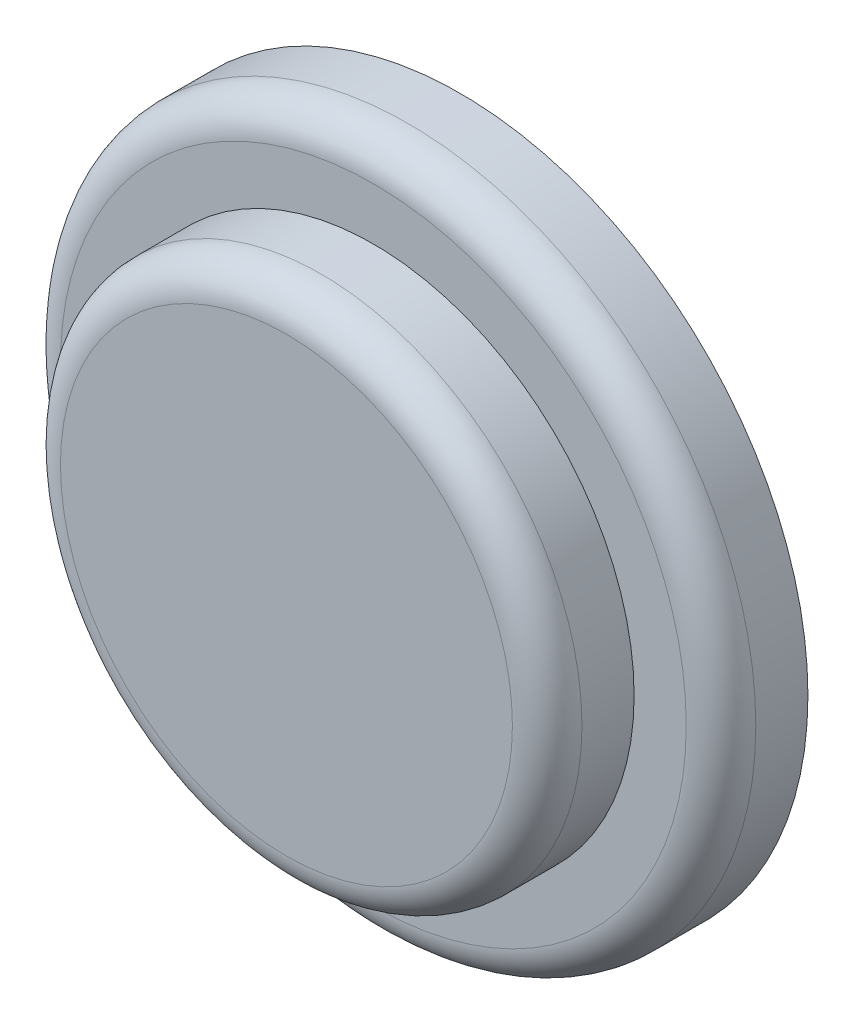
ISO-10303-21;
HEADER;
FILE_DESCRIPTION(('STEP AP214'),'2;1');
FILE_NAME('part.step','',(''),(''),'','','');
FILE_SCHEMA(('AUTOMOTIVE_DESIGN { 1 0 10303 214 1 1 1 1 }'));
ENDSEC;
DATA;
#1=APPLICATION_CONTEXT('core data for automotive mechanical design processes');
#2=APPLICATION_PROTOCOL_DEFINITION('international standard','automotive_design',2000,#1);
#3=PRODUCT_CONTEXT('',#1,'mechanical');
#4=PRODUCT('Part','Part','',(#3));
#5=PRODUCT_RELATED_PRODUCT_CATEGORY('part','',(#4));
#6=PRODUCT_DEFINITION_FORMATION('','',#4);
#7=PRODUCT_DEFINITION_CONTEXT('part definition',#1,'design');
#8=PRODUCT_DEFINITION('design','',#6,#7);
#9=PRODUCT_DEFINITION_SHAPE('','',#8);
#10=(LENGTH_UNIT() NAMED_UNIT(*) SI_UNIT(.MILLI.,.METRE.));
#11=(NAMED_UNIT(*) PLANE_ANGLE_UNIT() SI_UNIT($,.RADIAN.));
#12=(NAMED_UNIT(*) SI_UNIT($,.STERADIAN.) SOLID_ANGLE_UNIT());
#13=UNCERTAINTY_MEASURE_WITH_UNIT(LENGTH_MEASURE(1.E-05),#10,'distance_accuracy_value','');
#14=(GEOMETRIC_REPRESENTATION_CONTEXT(3) GLOBAL_UNCERTAINTY_ASSIGNED_CONTEXT((#13)) GLOBAL_UNIT_ASSIGNED_CONTEXT((#10,
#11,#12)) REPRESENTATION_CONTEXT('',''));
#15=CARTESIAN_POINT('',(0.,0.,0.));
#16=DIRECTION('',(0.,0.,1.));
#17=DIRECTION('',(1.,0.,0.));
#18=AXIS2_PLACEMENT_3D('',#15,#16,#17);
#19=CARTESIAN_POINT('',(0.,0.,10.));
#20=DIRECTION('',(0.,0.,-1.));
#21=DIRECTION('',(-1.,0.,0.));
#22=AXIS2_PLACEMENT_3D('',#19,#20,#21);
#23=CYLINDRICAL_SURFACE('',#22,20.);
#24=CARTESIAN_POINT('',(0.,0.,3.));
#25=DIRECTION('',(0.,0.,1.));
#26=DIRECTION('',(1.,0.,0.));
#27=AXIS2_PLACEMENT_3D('',#24,#25,#26);
#28=CIRCLE('',#27,20.);
#29=CARTESIAN_POINT('',(20.,0.,3.));
#30=VERTEX_POINT('',#29);
#31=EDGE_CURVE('E10',#30,#30,#28,.F.);
#32=ORIENTED_EDGE('',*,*,#31,.T.);
#33=EDGE_LOOP('',(#32));
#34=FACE_BOUND('',#33,.T.);
#35=CARTESIAN_POINT('',(0.,0.,0.));
#36=DIRECTION('',(0.,0.,1.));
#37=DIRECTION('',(1.,0.,0.));
#38=AXIS2_PLACEMENT_3D('',#35,#36,#37);
#39=CIRCLE('',#38,20.);
#40=CARTESIAN_POINT('',(20.,0.,0.));
#41=VERTEX_POINT('',#40);
#42=EDGE_CURVE('E53',#41,#41,#39,.T.);
#43=ORIENTED_EDGE('',*,*,#42,.T.);
#44=EDGE_LOOP('',(#43));
#45=FACE_BOUND('',#44,.T.);
#46=ADVANCED_FACE('F33',(#34,#45),#23,.T.);
#47=CARTESIAN_POINT('',(0.,0.,0.));
#48=DIRECTION('',(0.,0.,1.));
#49=DIRECTION('',(1.,0.,0.));
#50=AXIS2_PLACEMENT_3D('',#47,#48,#49);
#51=PLANE('',#50);
#52=CARTESIAN_POINT('',(0.,0.,0.));
#53=DIRECTION('',(0.,0.,-1.));
#54=DIRECTION('',(-1.,0.,0.));
#55=AXIS2_PLACEMENT_3D('',#52,#53,#54);
#56=CIRCLE('',#55,10.);
#57=CARTESIAN_POINT('',(-10.,0.,0.));
#58=VERTEX_POINT('',#57);
#59=EDGE_CURVE('E57',#58,#58,#56,.T.);
#60=ORIENTED_EDGE('',*,*,#59,.F.);
#61=EDGE_LOOP('',(#60));
#62=FACE_BOUND('',#61,.T.);
#63=ORIENTED_EDGE('',*,*,#42,.F.);
#64=EDGE_LOOP('',(#63));
#65=FACE_BOUND('',#64,.T.);
#66=ADVANCED_FACE('F83',(#62,#65),#51,.F.);
#67=CARTESIAN_POINT('',(0.,0.,5.));
#68=DIRECTION('',(0.,0.,-1.));
#69=DIRECTION('',(-1.,0.,0.));
#70=AXIS2_PLACEMENT_3D('',#67,#68,#69);
#71=CYLINDRICAL_SURFACE('',#70,10.);
#72=CARTESIAN_POINT('',(0.,0.,5.));
#73=DIRECTION('',(0.,0.,-1.));
#74=DIRECTION('',(-1.,0.,0.));
#75=AXIS2_PLACEMENT_3D('',#72,#73,#74);
#76=CIRCLE('',#75,10.);
#77=CARTESIAN_POINT('',(-10.,0.,5.));
#78=VERTEX_POINT('',#77);
#79=EDGE_CURVE('E56',#78,#78,#76,.T.);
#80=ORIENTED_EDGE('',*,*,#79,.F.);
#81=EDGE_LOOP('',(#80));
#82=FACE_BOUND('',#81,.T.);
#83=ORIENTED_EDGE('',*,*,#59,.T.);
#84=EDGE_LOOP('',(#83));
#85=FACE_BOUND('',#84,.T.);
#86=ADVANCED_FACE('F79',(#82,#85),#71,.F.);
#87=CARTESIAN_POINT('',(0.,0.,5.));
#88=DIRECTION('',(0.,0.,-1.));
#89=DIRECTION('',(-1.,0.,0.));
#90=AXIS2_PLACEMENT_3D('',#87,#88,#89);
#91=PLANE('',#90);
#92=ORIENTED_EDGE('',*,*,#79,.T.);
#93=EDGE_LOOP('',(#92));
#94=FACE_BOUND('',#93,.T.);
#95=ADVANCED_FACE('F70',(#94),#91,.T.);
#96=CARTESIAN_POINT('',(0.,0.,5.));
#97=DIRECTION('',(0.,0.,1.));
#98=DIRECTION('',(1.,0.,0.));
#99=AXIS2_PLACEMENT_3D('',#96,#97,#98);
#100=PLANE('',#99);
#101=CARTESIAN_POINT('',(0.,0.,5.));
#102=DIRECTION('',(0.,0.,1.));
#103=DIRECTION('',(1.,0.,0.));
#104=AXIS2_PLACEMENT_3D('',#101,#102,#103);
#105=CIRCLE('',#104,18.);
#106=CARTESIAN_POINT('',(18.,0.,5.));
#107=VERTEX_POINT('',#106);
#108=EDGE_CURVE('E40',#107,#107,#105,.T.);
#109=ORIENTED_EDGE('',*,*,#108,.T.);
#110=EDGE_LOOP('',(#109));
#111=FACE_BOUND('',#110,.T.);
#112=CARTESIAN_POINT('',(0.,0.,5.));
#113=DIRECTION('',(0.,0.,1.));
#114=DIRECTION('',(1.,0.,0.));
#115=AXIS2_PLACEMENT_3D('',#112,#113,#114);
#116=CIRCLE('',#115,15.);
#117=CARTESIAN_POINT('',(15.,0.,5.));
#118=VERTEX_POINT('',#117);
#119=EDGE_CURVE('E60',#118,#118,#116,.T.);
#120=ORIENTED_EDGE('',*,*,#119,.F.);
#121=EDGE_LOOP('',(#120));
#122=FACE_BOUND('',#121,.T.);
#123=ADVANCED_FACE('F68',(#111,#122),#100,.T.);
#124=CARTESIAN_POINT('',(0.,0.,5.));
#125=DIRECTION('',(0.,0.,1.));
#126=DIRECTION('',(1.,0.,0.));
#127=AXIS2_PLACEMENT_3D('',#124,#125,#126);
#128=CYLINDRICAL_SURFACE('',#127,15.);
#129=CARTESIAN_POINT('',(0.,0.,8.));
#130=DIRECTION('',(0.,0.,1.));
#131=DIRECTION('',(1.,0.,0.));
#132=AXIS2_PLACEMENT_3D('',#129,#130,#131);
#133=CIRCLE('',#132,15.);
#134=CARTESIAN_POINT('',(15.,0.,8.));
#135=VERTEX_POINT('',#134);
#136=EDGE_CURVE('E44',#135,#135,#133,.F.);
#137=ORIENTED_EDGE('',*,*,#136,.T.);
#138=EDGE_LOOP('',(#137));
#139=FACE_BOUND('',#138,.T.);
#140=ORIENTED_EDGE('',*,*,#119,.T.);
#141=EDGE_LOOP('',(#140));
#142=FACE_BOUND('',#141,.T.);
#143=ADVANCED_FACE('F66',(#139,#142),#128,.T.);
#144=CARTESIAN_POINT('',(0.,0.,10.));
#145=DIRECTION('',(0.,0.,1.));
#146=DIRECTION('',(1.,0.,0.));
#147=AXIS2_PLACEMENT_3D('',#144,#145,#146);
#148=PLANE('',#147);
#149=CARTESIAN_POINT('',(0.,0.,10.));
#150=DIRECTION('',(0.,0.,1.));
#151=DIRECTION('',(1.,0.,0.));
#152=AXIS2_PLACEMENT_3D('',#149,#150,#151);
#153=CIRCLE('',#152,13.);
#154=CARTESIAN_POINT('',(13.,0.,10.));
#155=VERTEX_POINT('',#154);
#156=EDGE_CURVE('E48',#155,#155,#153,.T.);
#157=ORIENTED_EDGE('',*,*,#156,.T.);
#158=EDGE_LOOP('',(#157));
#159=FACE_BOUND('',#158,.T.);
#160=ADVANCED_FACE('F76',(#159),#148,.T.);
#161=CARTESIAN_POINT('',(0.,0.,8.));
#162=DIRECTION('',(0.,0.,1.));
#163=DIRECTION('',(1.,0.,0.));
#164=AXIS2_PLACEMENT_3D('',#161,#162,#163);
#165=TOROIDAL_SURFACE('',#164,13.,2.);
#166=ORIENTED_EDGE('',*,*,#136,.F.);
#167=EDGE_LOOP('',(#166));
#168=FACE_BOUND('',#167,.T.);
#169=ORIENTED_EDGE('',*,*,#156,.F.);
#170=EDGE_LOOP('',(#169));
#171=FACE_BOUND('',#170,.T.);
#172=ADVANCED_FACE('F92',(#168,#171),#165,.T.);
#173=CARTESIAN_POINT('',(0.,0.,3.));
#174=DIRECTION('',(0.,0.,1.));
#175=DIRECTION('',(1.,0.,0.));
#176=AXIS2_PLACEMENT_3D('',#173,#174,#175);
#177=TOROIDAL_SURFACE('',#176,18.,2.);
#178=ORIENTED_EDGE('',*,*,#31,.F.);
#179=EDGE_LOOP('',(#178));
#180=FACE_BOUND('',#179,.T.);
#181=ORIENTED_EDGE('',*,*,#108,.F.);
#182=EDGE_LOOP('',(#181));
#183=FACE_BOUND('',#182,.T.);
#184=ADVANCED_FACE('F35',(#180,#183),#177,.T.);
#185=CLOSED_SHELL('',(#46,#66,#86,#95,#123,#143,#160,#172,#184));
#186=MANIFOLD_SOLID_BREP('B2',#185);
#187=ADVANCED_BREP_SHAPE_REPRESENTATION('',(#18,#186),#14);
#188=SHAPE_DEFINITION_REPRESENTATION(#9,#187);
ENDSEC;
END-ISO-10303-21;
